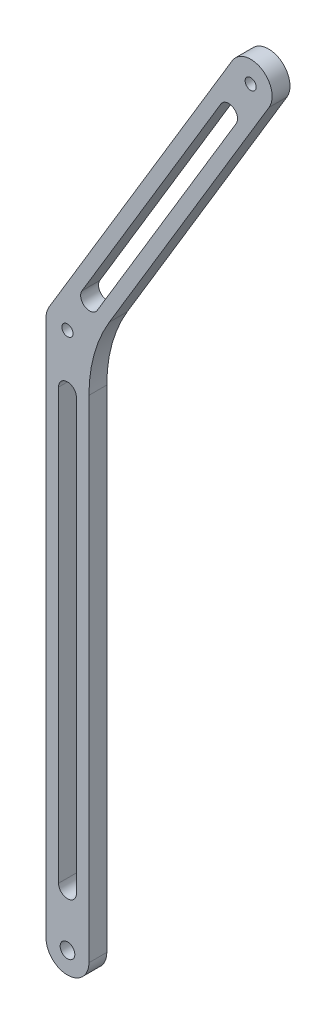
ISO-10303-21;
HEADER;
FILE_DESCRIPTION(('STEP AP214'),'2;1');
FILE_NAME('part.step','',(''),(''),'','','');
FILE_SCHEMA(('AUTOMOTIVE_DESIGN { 1 0 10303 214 1 1 1 1 }'));
ENDSEC;
DATA;
#1=APPLICATION_CONTEXT('core data for automotive mechanical design processes');
#2=APPLICATION_PROTOCOL_DEFINITION('international standard','automotive_design',2000,#1);
#3=PRODUCT_CONTEXT('',#1,'mechanical');
#4=PRODUCT('Part','Part','',(#3));
#5=PRODUCT_RELATED_PRODUCT_CATEGORY('part','',(#4));
#6=PRODUCT_DEFINITION_FORMATION('','',#4);
#7=PRODUCT_DEFINITION_CONTEXT('part definition',#1,'design');
#8=PRODUCT_DEFINITION('design','',#6,#7);
#9=PRODUCT_DEFINITION_SHAPE('','',#8);
#10=(LENGTH_UNIT() NAMED_UNIT(*) SI_UNIT(.MILLI.,.METRE.));
#11=(NAMED_UNIT(*) PLANE_ANGLE_UNIT() SI_UNIT($,.RADIAN.));
#12=(NAMED_UNIT(*) SI_UNIT($,.STERADIAN.) SOLID_ANGLE_UNIT());
#13=UNCERTAINTY_MEASURE_WITH_UNIT(LENGTH_MEASURE(1.E-05),#10,'distance_accuracy_value','');
#14=(GEOMETRIC_REPRESENTATION_CONTEXT(3) GLOBAL_UNCERTAINTY_ASSIGNED_CONTEXT((#13)) GLOBAL_UNIT_ASSIGNED_CONTEXT((#10,
#11,#12)) REPRESENTATION_CONTEXT('',''));
#15=CARTESIAN_POINT('',(0.,0.,0.));
#16=DIRECTION('',(0.,0.,1.));
#17=DIRECTION('',(1.,0.,0.));
#18=AXIS2_PLACEMENT_3D('',#15,#16,#17);
#19=CARTESIAN_POINT('',(-71.4517074672331,42.9315644578435,5.));
#20=DIRECTION('',(0.85717234641918,-0.515029677333489,0.));
#21=DIRECTION('',(0.515029677333489,0.85717234641918,0.));
#22=AXIS2_PLACEMENT_3D('',#19,#20,#21);
#23=PLANE('',#22);
#24=DIRECTION('',(-0.515029677333489,-0.85717234641918,0.));
#25=VECTOR('',#24,1.);
#26=CARTESIAN_POINT('',(-71.4517074672331,42.9315644578435,0.));
#27=LINE('',#26,#25);
#28=CARTESIAN_POINT('',(46.1024188161671,238.578826532709,0.));
#29=VERTEX_POINT('',#28);
#30=CARTESIAN_POINT('',(-5.14303407851509,153.290178064001,0.));
#31=VERTEX_POINT('',#30);
#32=EDGE_CURVE('E209',#29,#31,#27,.T.);
#33=ORIENTED_EDGE('',*,*,#32,.T.);
#34=DIRECTION('',(0.,0.,-1.));
#35=VECTOR('',#34,1.);
#36=CARTESIAN_POINT('',(-5.14303407851509,153.290178064001,5.));
#37=LINE('',#36,#35);
#38=CARTESIAN_POINT('',(-5.14303407851509,153.290178064001,5.));
#39=VERTEX_POINT('',#38);
#40=EDGE_CURVE('E281',#39,#31,#37,.T.);
#41=ORIENTED_EDGE('',*,*,#40,.F.);
#42=DIRECTION('',(-0.515029677333489,-0.85717234641918,0.));
#43=VECTOR('',#42,1.);
#44=CARTESIAN_POINT('',(-71.4517074672331,42.9315644578435,5.));
#45=LINE('',#44,#43);
#46=CARTESIAN_POINT('',(46.1024188161671,238.578826532709,5.));
#47=VERTEX_POINT('',#46);
#48=EDGE_CURVE('E216',#47,#39,#45,.T.);
#49=ORIENTED_EDGE('',*,*,#48,.F.);
#50=DIRECTION('',(0.,0.,-1.));
#51=VECTOR('',#50,1.);
#52=CARTESIAN_POINT('',(46.1024188161671,238.578826532709,5.));
#53=LINE('',#52,#51);
#54=EDGE_CURVE('E243',#47,#29,#53,.T.);
#55=ORIENTED_EDGE('',*,*,#54,.T.);
#56=EDGE_LOOP('',(#33,#41,#49,#55));
#57=FACE_BOUND('',#56,.T.);
#58=ADVANCED_FACE('F35',(#57),#23,.F.);
#59=CARTESIAN_POINT('',(0.,150.2,5.));
#60=DIRECTION('',(0.,0.,-1.));
#61=DIRECTION('',(-1.,0.,0.));
#62=AXIS2_PLACEMENT_3D('',#59,#60,#61);
#63=CYLINDRICAL_SURFACE('',#62,6.);
#64=CARTESIAN_POINT('',(0.,150.2,0.));
#65=DIRECTION('',(0.,0.,1.));
#66=DIRECTION('',(1.,0.,0.));
#67=AXIS2_PLACEMENT_3D('',#64,#65,#66);
#68=CIRCLE('',#67,6.);
#69=CARTESIAN_POINT('',(-6.00000000000001,150.2,0.));
#70=VERTEX_POINT('',#69);
#71=EDGE_CURVE('E246',#31,#70,#68,.T.);
#72=ORIENTED_EDGE('',*,*,#71,.T.);
#73=DIRECTION('',(0.,0.,-1.));
#74=VECTOR('',#73,1.);
#75=CARTESIAN_POINT('',(-6.00000000000001,150.2,5.));
#76=LINE('',#75,#74);
#77=CARTESIAN_POINT('',(-6.00000000000001,150.2,5.));
#78=VERTEX_POINT('',#77);
#79=EDGE_CURVE('E278',#78,#70,#76,.T.);
#80=ORIENTED_EDGE('',*,*,#79,.F.);
#81=CARTESIAN_POINT('',(0.,150.2,5.));
#82=DIRECTION('',(0.,0.,1.));
#83=DIRECTION('',(1.,0.,0.));
#84=AXIS2_PLACEMENT_3D('',#81,#82,#83);
#85=CIRCLE('',#84,6.);
#86=EDGE_CURVE('E219',#39,#78,#85,.T.);
#87=ORIENTED_EDGE('',*,*,#86,.F.);
#88=ORIENTED_EDGE('',*,*,#40,.T.);
#89=EDGE_LOOP('',(#72,#80,#87,#88));
#90=FACE_BOUND('',#89,.T.);
#91=ADVANCED_FACE('F318',(#90),#63,.T.);
#92=CARTESIAN_POINT('',(-6.,0.,5.));
#93=DIRECTION('',(1.,0.,0.));
#94=DIRECTION('',(0.,1.,0.));
#95=AXIS2_PLACEMENT_3D('',#92,#93,#94);
#96=PLANE('',#95);
#97=DIRECTION('',(0.,-1.,0.));
#98=VECTOR('',#97,1.);
#99=CARTESIAN_POINT('',(-6.,0.,0.));
#100=LINE('',#99,#98);
#101=CARTESIAN_POINT('',(-6.,0.,0.));
#102=VERTEX_POINT('',#101);
#103=EDGE_CURVE('E248',#70,#102,#100,.T.);
#104=ORIENTED_EDGE('',*,*,#103,.T.);
#105=DIRECTION('',(0.,0.,-1.));
#106=VECTOR('',#105,1.);
#107=CARTESIAN_POINT('',(-6.,0.,5.));
#108=LINE('',#107,#106);
#109=CARTESIAN_POINT('',(-6.,0.,5.));
#110=VERTEX_POINT('',#109);
#111=EDGE_CURVE('E275',#110,#102,#108,.T.);
#112=ORIENTED_EDGE('',*,*,#111,.F.);
#113=DIRECTION('',(0.,-1.,0.));
#114=VECTOR('',#113,1.);
#115=CARTESIAN_POINT('',(-6.,0.,5.));
#116=LINE('',#115,#114);
#117=EDGE_CURVE('E222',#78,#110,#116,.T.);
#118=ORIENTED_EDGE('',*,*,#117,.F.);
#119=ORIENTED_EDGE('',*,*,#79,.T.);
#120=EDGE_LOOP('',(#104,#112,#118,#119));
#121=FACE_BOUND('',#120,.T.);
#122=ADVANCED_FACE('F323',(#121),#96,.F.);
#123=CARTESIAN_POINT('',(0.,0.,5.));
#124=DIRECTION('',(0.,0.,-1.));
#125=DIRECTION('',(-1.,0.,0.));
#126=AXIS2_PLACEMENT_3D('',#123,#124,#125);
#127=CYLINDRICAL_SURFACE('',#126,6.);
#128=CARTESIAN_POINT('',(0.,0.,0.));
#129=DIRECTION('',(0.,0.,1.));
#130=DIRECTION('',(1.,0.,0.));
#131=AXIS2_PLACEMENT_3D('',#128,#129,#130);
#132=CIRCLE('',#131,6.);
#133=CARTESIAN_POINT('',(6.,0.,0.));
#134=VERTEX_POINT('',#133);
#135=EDGE_CURVE('E250',#102,#134,#132,.T.);
#136=ORIENTED_EDGE('',*,*,#135,.T.);
#137=DIRECTION('',(0.,0.,-1.));
#138=VECTOR('',#137,1.);
#139=CARTESIAN_POINT('',(6.,0.,5.));
#140=LINE('',#139,#138);
#141=CARTESIAN_POINT('',(6.,0.,5.));
#142=VERTEX_POINT('',#141);
#143=EDGE_CURVE('E272',#142,#134,#140,.T.);
#144=ORIENTED_EDGE('',*,*,#143,.F.);
#145=CARTESIAN_POINT('',(0.,0.,5.));
#146=DIRECTION('',(0.,0.,1.));
#147=DIRECTION('',(1.,0.,0.));
#148=AXIS2_PLACEMENT_3D('',#145,#146,#147);
#149=CIRCLE('',#148,6.);
#150=EDGE_CURVE('E224',#110,#142,#149,.T.);
#151=ORIENTED_EDGE('',*,*,#150,.F.);
#152=ORIENTED_EDGE('',*,*,#111,.T.);
#153=EDGE_LOOP('',(#136,#144,#151,#152));
#154=FACE_BOUND('',#153,.T.);
#155=ADVANCED_FACE('F326',(#154),#127,.T.);
#156=CARTESIAN_POINT('',(6.,0.,5.));
#157=DIRECTION('',(1.,0.,0.));
#158=DIRECTION('',(0.,1.,0.));
#159=AXIS2_PLACEMENT_3D('',#156,#157,#158);
#160=PLANE('',#159);
#161=DIRECTION('',(0.,-1.,0.));
#162=VECTOR('',#161,1.);
#163=CARTESIAN_POINT('',(6.,0.,0.));
#164=LINE('',#163,#162);
#165=CARTESIAN_POINT('',(6.00000000000002,137.44331363052,0.));
#166=VERTEX_POINT('',#165);
#167=EDGE_CURVE('E253',#166,#134,#164,.T.);
#168=ORIENTED_EDGE('',*,*,#167,.F.);
#169=DIRECTION('',(0.,0.,-1.));
#170=VECTOR('',#169,1.);
#171=CARTESIAN_POINT('',(6.00000000000002,137.44331363052,5.));
#172=LINE('',#171,#170);
#173=CARTESIAN_POINT('',(6.00000000000002,137.44331363052,5.));
#174=VERTEX_POINT('',#173);
#175=EDGE_CURVE('E287',#166,#174,#172,.F.);
#176=ORIENTED_EDGE('',*,*,#175,.T.);
#177=DIRECTION('',(0.,-1.,0.));
#178=VECTOR('',#177,1.);
#179=CARTESIAN_POINT('',(6.,0.,5.));
#180=LINE('',#179,#178);
#181=EDGE_CURVE('E227',#174,#142,#180,.T.);
#182=ORIENTED_EDGE('',*,*,#181,.T.);
#183=ORIENTED_EDGE('',*,*,#143,.T.);
#184=EDGE_LOOP('',(#168,#176,#182,#183));
#185=FACE_BOUND('',#184,.T.);
#186=ADVANCED_FACE('F299',(#185),#160,.T.);
#187=CARTESIAN_POINT('',(-61.165639310203,36.7512083298416,5.));
#188=DIRECTION('',(0.85717234641918,-0.515029677333489,0.));
#189=DIRECTION('',(0.515029677333489,0.85717234641918,0.));
#190=AXIS2_PLACEMENT_3D('',#187,#188,#189);
#191=PLANE('',#190);
#192=DIRECTION('',(-0.515029677333489,-0.85717234641918,0.));
#193=VECTOR('',#192,1.);
#194=CARTESIAN_POINT('',(-61.165639310203,36.7512083298416,5.));
#195=LINE('',#194,#193);
#196=CARTESIAN_POINT('',(56.3884869731972,232.398470404707,5.));
#197=VERTEX_POINT('',#196);
#198=CARTESIAN_POINT('',(11.7131061432329,158.04450072386,5.));
#199=VERTEX_POINT('',#198);
#200=EDGE_CURVE('E229',#197,#199,#195,.T.);
#201=ORIENTED_EDGE('',*,*,#200,.T.);
#202=DIRECTION('',(0.,0.,-1.));
#203=VECTOR('',#202,1.);
#204=CARTESIAN_POINT('',(11.7131061432328,158.04450072386,0.));
#205=LINE('',#204,#203);
#206=CARTESIAN_POINT('',(11.7131061432329,158.04450072386,0.));
#207=VERTEX_POINT('',#206);
#208=EDGE_CURVE('E284',#199,#207,#205,.T.);
#209=ORIENTED_EDGE('',*,*,#208,.T.);
#210=DIRECTION('',(-0.515029677333489,-0.85717234641918,0.));
#211=VECTOR('',#210,1.);
#212=CARTESIAN_POINT('',(-61.165639310203,36.7512083298416,0.));
#213=LINE('',#212,#211);
#214=CARTESIAN_POINT('',(56.3884869731972,232.398470404707,0.));
#215=VERTEX_POINT('',#214);
#216=EDGE_CURVE('E255',#215,#207,#213,.T.);
#217=ORIENTED_EDGE('',*,*,#216,.F.);
#218=DIRECTION('',(0.,0.,-1.));
#219=VECTOR('',#218,1.);
#220=CARTESIAN_POINT('',(56.3884869731972,232.398470404707,5.));
#221=LINE('',#220,#219);
#222=EDGE_CURVE('E270',#197,#215,#221,.T.);
#223=ORIENTED_EDGE('',*,*,#222,.F.);
#224=EDGE_LOOP('',(#201,#209,#217,#223));
#225=FACE_BOUND('',#224,.T.);
#226=ADVANCED_FACE('F308',(#225),#191,.T.);
#227=CARTESIAN_POINT('',(0.,150.2,5.));
#228=DIRECTION('',(0.,0.,-1.));
#229=DIRECTION('',(-1.,0.,0.));
#230=AXIS2_PLACEMENT_3D('',#227,#228,#229);
#231=CYLINDRICAL_SURFACE('',#230,1.55);
#232=CARTESIAN_POINT('',(0.,150.2,5.));
#233=DIRECTION('',(0.,0.,1.));
#234=DIRECTION('',(1.,0.,0.));
#235=AXIS2_PLACEMENT_3D('',#232,#233,#234);
#236=CIRCLE('',#235,1.55);
#237=CARTESIAN_POINT('',(1.55,150.2,5.));
#238=VERTEX_POINT('',#237);
#239=EDGE_CURVE('E237',#238,#238,#236,.T.);
#240=ORIENTED_EDGE('',*,*,#239,.T.);
#241=EDGE_LOOP('',(#240));
#242=FACE_BOUND('',#241,.T.);
#243=CARTESIAN_POINT('',(0.,150.2,0.));
#244=DIRECTION('',(0.,0.,1.));
#245=DIRECTION('',(1.,0.,0.));
#246=AXIS2_PLACEMENT_3D('',#243,#244,#245);
#247=CIRCLE('',#246,1.55);
#248=CARTESIAN_POINT('',(1.55,150.2,0.));
#249=VERTEX_POINT('',#248);
#250=EDGE_CURVE('E263',#249,#249,#247,.T.);
#251=ORIENTED_EDGE('',*,*,#250,.F.);
#252=EDGE_LOOP('',(#251));
#253=FACE_BOUND('',#252,.T.);
#254=ADVANCED_FACE('F356',(#242,#253),#231,.F.);
#255=CARTESIAN_POINT('',(0.,0.,5.));
#256=DIRECTION('',(0.,0.,-1.));
#257=DIRECTION('',(-1.,0.,0.));
#258=AXIS2_PLACEMENT_3D('',#255,#256,#257);
#259=CYLINDRICAL_SURFACE('',#258,2.05);
#260=CARTESIAN_POINT('',(0.,0.,5.));
#261=DIRECTION('',(0.,0.,1.));
#262=DIRECTION('',(1.,0.,0.));
#263=AXIS2_PLACEMENT_3D('',#260,#261,#262);
#264=CIRCLE('',#263,2.05);
#265=CARTESIAN_POINT('',(2.05,0.,5.));
#266=VERTEX_POINT('',#265);
#267=EDGE_CURVE('E234',#266,#266,#264,.T.);
#268=ORIENTED_EDGE('',*,*,#267,.T.);
#269=EDGE_LOOP('',(#268));
#270=FACE_BOUND('',#269,.T.);
#271=CARTESIAN_POINT('',(0.,0.,0.));
#272=DIRECTION('',(0.,0.,1.));
#273=DIRECTION('',(1.,0.,0.));
#274=AXIS2_PLACEMENT_3D('',#271,#272,#273);
#275=CIRCLE('',#274,2.05);
#276=CARTESIAN_POINT('',(2.05,0.,0.));
#277=VERTEX_POINT('',#276);
#278=EDGE_CURVE('E260',#277,#277,#275,.T.);
#279=ORIENTED_EDGE('',*,*,#278,.F.);
#280=EDGE_LOOP('',(#279));
#281=FACE_BOUND('',#280,.T.);
#282=ADVANCED_FACE('F361',(#270,#281),#259,.F.);
#283=CARTESIAN_POINT('',(51.2454528946822,235.488648468708,5.));
#284=DIRECTION('',(0.,0.,-1.));
#285=DIRECTION('',(-1.,0.,0.));
#286=AXIS2_PLACEMENT_3D('',#283,#284,#285);
#287=CYLINDRICAL_SURFACE('',#286,5.99999999999999);
#288=CARTESIAN_POINT('',(51.2454528946822,235.488648468708,0.));
#289=DIRECTION('',(0.,0.,1.));
#290=DIRECTION('',(1.,0.,0.));
#291=AXIS2_PLACEMENT_3D('',#288,#289,#290);
#292=CIRCLE('',#291,5.99999999999999);
#293=EDGE_CURVE('E258',#215,#29,#292,.T.);
#294=ORIENTED_EDGE('',*,*,#293,.T.);
#295=ORIENTED_EDGE('',*,*,#54,.F.);
#296=CARTESIAN_POINT('',(51.2454528946822,235.488648468708,5.));
#297=DIRECTION('',(0.,0.,1.));
#298=DIRECTION('',(1.,0.,0.));
#299=AXIS2_PLACEMENT_3D('',#296,#297,#298);
#300=CIRCLE('',#299,5.99999999999999);
#301=EDGE_CURVE('E232',#197,#47,#300,.T.);
#302=ORIENTED_EDGE('',*,*,#301,.F.);
#303=ORIENTED_EDGE('',*,*,#222,.T.);
#304=EDGE_LOOP('',(#294,#295,#302,#303));
#305=FACE_BOUND('',#304,.T.);
#306=ADVANCED_FACE('F312',(#305),#287,.T.);
#307=CARTESIAN_POINT('',(51.2454528946822,235.488648468708,5.));
#308=DIRECTION('',(0.,0.,-1.));
#309=DIRECTION('',(-1.,0.,0.));
#310=AXIS2_PLACEMENT_3D('',#307,#308,#309);
#311=CYLINDRICAL_SURFACE('',#310,1.55);
#312=CARTESIAN_POINT('',(51.2454528946822,235.488648468708,5.));
#313=DIRECTION('',(0.,0.,1.));
#314=DIRECTION('',(1.,0.,0.));
#315=AXIS2_PLACEMENT_3D('',#312,#313,#314);
#316=CIRCLE('',#315,1.55);
#317=CARTESIAN_POINT('',(52.7954528946822,235.488648468708,5.));
#318=VERTEX_POINT('',#317);
#319=EDGE_CURVE('E240',#318,#318,#316,.T.);
#320=ORIENTED_EDGE('',*,*,#319,.T.);
#321=EDGE_LOOP('',(#320));
#322=FACE_BOUND('',#321,.T.);
#323=CARTESIAN_POINT('',(51.2454528946822,235.488648468708,0.));
#324=DIRECTION('',(0.,0.,1.));
#325=DIRECTION('',(1.,0.,0.));
#326=AXIS2_PLACEMENT_3D('',#323,#324,#325);
#327=CIRCLE('',#326,1.55);
#328=CARTESIAN_POINT('',(52.7954528946822,235.488648468708,0.));
#329=VERTEX_POINT('',#328);
#330=EDGE_CURVE('E220',#329,#329,#327,.T.);
#331=ORIENTED_EDGE('',*,*,#330,.F.);
#332=EDGE_LOOP('',(#331));
#333=FACE_BOUND('',#332,.T.);
#334=ADVANCED_FACE('F382',(#322,#333),#311,.F.);
#335=CARTESIAN_POINT('',(0.,0.,5.));
#336=DIRECTION('',(0.,0.,1.));
#337=DIRECTION('',(1.,0.,0.));
#338=AXIS2_PLACEMENT_3D('',#335,#336,#337);
#339=PLANE('',#338);
#340=CARTESIAN_POINT('',(45.0650967666803,225.202580311678,5.));
#341=DIRECTION('',(0.,0.,1.));
#342=DIRECTION('',(1.,0.,0.));
#343=AXIS2_PLACEMENT_3D('',#340,#341,#342);
#344=CIRCLE('',#343,2.5);
#345=CARTESIAN_POINT('',(47.2080276327283,223.915006118345,5.));
#346=VERTEX_POINT('',#345);
#347=CARTESIAN_POINT('',(42.9221659006324,226.490154505012,5.));
#348=VERTEX_POINT('',#347);
#349=EDGE_CURVE('E50',#346,#348,#344,.T.);
#350=ORIENTED_EDGE('',*,*,#349,.F.);
#351=DIRECTION('',(0.515029677333489,0.85717234641918,0.));
#352=VECTOR('',#351,1.);
#353=CARTESIAN_POINT('',(47.2080276327283,223.915006118345,5.));
#354=LINE('',#353,#352);
#355=CARTESIAN_POINT('',(8.32328699404983,159.198493963696,5.));
#356=VERTEX_POINT('',#355);
#357=EDGE_CURVE('E165',#356,#346,#354,.T.);
#358=ORIENTED_EDGE('',*,*,#357,.F.);
#359=CARTESIAN_POINT('',(6.18035612800187,160.48606815703,5.));
#360=DIRECTION('',(0.,0.,1.));
#361=DIRECTION('',(1.,0.,0.));
#362=AXIS2_PLACEMENT_3D('',#359,#360,#361);
#363=CIRCLE('',#362,2.50000000000001);
#364=CARTESIAN_POINT('',(4.03742526195391,161.773642350364,5.));
#365=VERTEX_POINT('',#364);
#366=EDGE_CURVE('E168',#365,#356,#363,.T.);
#367=ORIENTED_EDGE('',*,*,#366,.F.);
#368=DIRECTION('',(-0.515029677333489,-0.857172346419179,0.));
#369=VECTOR('',#368,1.);
#370=CARTESIAN_POINT('',(42.9221659006324,226.490154505012,5.));
#371=LINE('',#370,#369);
#372=EDGE_CURVE('E174',#348,#365,#371,.T.);
#373=ORIENTED_EDGE('',*,*,#372,.F.);
#374=EDGE_LOOP('',(#350,#358,#367,#373));
#375=FACE_BOUND('',#374,.T.);
#376=CARTESIAN_POINT('',(0.,135.2,5.));
#377=DIRECTION('',(0.,0.,1.));
#378=DIRECTION('',(1.,0.,0.));
#379=AXIS2_PLACEMENT_3D('',#376,#377,#378);
#380=CIRCLE('',#379,2.5);
#381=CARTESIAN_POINT('',(2.5,135.2,5.));
#382=VERTEX_POINT('',#381);
#383=CARTESIAN_POINT('',(-2.5,135.2,5.));
#384=VERTEX_POINT('',#383);
#385=EDGE_CURVE('E180',#382,#384,#380,.T.);
#386=ORIENTED_EDGE('',*,*,#385,.F.);
#387=DIRECTION('',(0.,1.,0.));
#388=VECTOR('',#387,1.);
#389=CARTESIAN_POINT('',(2.5,135.2,5.));
#390=LINE('',#389,#388);
#391=CARTESIAN_POINT('',(2.50000000000002,15.,5.));
#392=VERTEX_POINT('',#391);
#393=EDGE_CURVE('E188',#392,#382,#390,.T.);
#394=ORIENTED_EDGE('',*,*,#393,.F.);
#395=CARTESIAN_POINT('',(0.,15.,5.));
#396=DIRECTION('',(0.,0.,1.));
#397=DIRECTION('',(1.,0.,0.));
#398=AXIS2_PLACEMENT_3D('',#395,#396,#397);
#399=CIRCLE('',#398,2.5);
#400=CARTESIAN_POINT('',(-2.49999999999998,15.,5.));
#401=VERTEX_POINT('',#400);
#402=EDGE_CURVE('E202',#401,#392,#399,.T.);
#403=ORIENTED_EDGE('',*,*,#402,.F.);
#404=DIRECTION('',(0.,-1.,0.));
#405=VECTOR('',#404,1.);
#406=CARTESIAN_POINT('',(-2.5,135.2,5.));
#407=LINE('',#406,#405);
#408=EDGE_CURVE('E199',#384,#401,#407,.T.);
#409=ORIENTED_EDGE('',*,*,#408,.F.);
#410=EDGE_LOOP('',(#386,#394,#403,#409));
#411=FACE_BOUND('',#410,.T.);
#412=ORIENTED_EDGE('',*,*,#48,.T.);
#413=ORIENTED_EDGE('',*,*,#86,.T.);
#414=ORIENTED_EDGE('',*,*,#117,.T.);
#415=ORIENTED_EDGE('',*,*,#150,.T.);
#416=ORIENTED_EDGE('',*,*,#181,.F.);
#417=CARTESIAN_POINT('',(46.,137.44331363052,5.));
#418=DIRECTION('',(0.,0.,1.));
#419=DIRECTION('',(1.,0.,0.));
#420=AXIS2_PLACEMENT_3D('',#417,#418,#419);
#421=CIRCLE('',#420,40.);
#422=EDGE_CURVE('E11',#174,#199,#421,.F.);
#423=ORIENTED_EDGE('',*,*,#422,.T.);
#424=ORIENTED_EDGE('',*,*,#200,.F.);
#425=ORIENTED_EDGE('',*,*,#301,.T.);
#426=EDGE_LOOP('',(#412,#413,#414,#415,#416,#423,#424,#425));
#427=FACE_BOUND('',#426,.T.);
#428=ORIENTED_EDGE('',*,*,#267,.F.);
#429=EDGE_LOOP('',(#428));
#430=FACE_BOUND('',#429,.T.);
#431=ORIENTED_EDGE('',*,*,#239,.F.);
#432=EDGE_LOOP('',(#431));
#433=FACE_BOUND('',#432,.T.);
#434=ORIENTED_EDGE('',*,*,#319,.F.);
#435=EDGE_LOOP('',(#434));
#436=FACE_BOUND('',#435,.T.);
#437=ADVANCED_FACE('F305',(#375,#411,#427,#430,#433,#436),#339,.T.);
#438=CARTESIAN_POINT('',(0.,0.,0.));
#439=DIRECTION('',(0.,0.,1.));
#440=DIRECTION('',(1.,0.,0.));
#441=AXIS2_PLACEMENT_3D('',#438,#439,#440);
#442=PLANE('',#441);
#443=DIRECTION('',(0.515029677333489,0.85717234641918,0.));
#444=VECTOR('',#443,1.);
#445=CARTESIAN_POINT('',(47.2080276327283,223.915006118345,0.));
#446=LINE('',#445,#444);
#447=CARTESIAN_POINT('',(8.32328699404983,159.198493963696,0.));
#448=VERTEX_POINT('',#447);
#449=CARTESIAN_POINT('',(47.2080276327283,223.915006118345,0.));
#450=VERTEX_POINT('',#449);
#451=EDGE_CURVE('E155',#448,#450,#446,.T.);
#452=ORIENTED_EDGE('',*,*,#451,.T.);
#453=CARTESIAN_POINT('',(45.0650967666803,225.202580311678,0.));
#454=DIRECTION('',(0.,0.,1.));
#455=DIRECTION('',(1.,0.,0.));
#456=AXIS2_PLACEMENT_3D('',#453,#454,#455);
#457=CIRCLE('',#456,2.5);
#458=CARTESIAN_POINT('',(42.9221659006324,226.490154505012,0.));
#459=VERTEX_POINT('',#458);
#460=EDGE_CURVE('E149',#450,#459,#457,.T.);
#461=ORIENTED_EDGE('',*,*,#460,.T.);
#462=DIRECTION('',(-0.515029677333489,-0.857172346419179,0.));
#463=VECTOR('',#462,1.);
#464=CARTESIAN_POINT('',(42.9221659006324,226.490154505012,0.));
#465=LINE('',#464,#463);
#466=CARTESIAN_POINT('',(4.0374252619539,161.773642350364,0.));
#467=VERTEX_POINT('',#466);
#468=EDGE_CURVE('E158',#459,#467,#465,.T.);
#469=ORIENTED_EDGE('',*,*,#468,.T.);
#470=CARTESIAN_POINT('',(6.18035612800187,160.48606815703,0.));
#471=DIRECTION('',(0.,0.,1.));
#472=DIRECTION('',(1.,0.,0.));
#473=AXIS2_PLACEMENT_3D('',#470,#471,#472);
#474=CIRCLE('',#473,2.50000000000001);
#475=EDGE_CURVE('E58',#467,#448,#474,.T.);
#476=ORIENTED_EDGE('',*,*,#475,.T.);
#477=EDGE_LOOP('',(#452,#461,#469,#476));
#478=FACE_BOUND('',#477,.T.);
#479=DIRECTION('',(0.,1.,0.));
#480=VECTOR('',#479,1.);
#481=CARTESIAN_POINT('',(2.5,135.2,0.));
#482=LINE('',#481,#480);
#483=CARTESIAN_POINT('',(2.50000000000002,15.,0.));
#484=VERTEX_POINT('',#483);
#485=CARTESIAN_POINT('',(2.5,135.2,0.));
#486=VERTEX_POINT('',#485);
#487=EDGE_CURVE('E194',#484,#486,#482,.T.);
#488=ORIENTED_EDGE('',*,*,#487,.T.);
#489=CARTESIAN_POINT('',(0.,135.2,0.));
#490=DIRECTION('',(0.,0.,1.));
#491=DIRECTION('',(1.,0.,0.));
#492=AXIS2_PLACEMENT_3D('',#489,#490,#491);
#493=CIRCLE('',#492,2.5);
#494=CARTESIAN_POINT('',(-2.5,135.2,0.));
#495=VERTEX_POINT('',#494);
#496=EDGE_CURVE('E184',#486,#495,#493,.T.);
#497=ORIENTED_EDGE('',*,*,#496,.T.);
#498=DIRECTION('',(0.,-1.,0.));
#499=VECTOR('',#498,1.);
#500=CARTESIAN_POINT('',(-2.5,135.2,0.));
#501=LINE('',#500,#499);
#502=CARTESIAN_POINT('',(-2.49999999999998,15.,0.));
#503=VERTEX_POINT('',#502);
#504=EDGE_CURVE('E187',#495,#503,#501,.T.);
#505=ORIENTED_EDGE('',*,*,#504,.T.);
#506=CARTESIAN_POINT('',(0.,15.,0.));
#507=DIRECTION('',(0.,0.,1.));
#508=DIRECTION('',(1.,0.,0.));
#509=AXIS2_PLACEMENT_3D('',#506,#507,#508);
#510=CIRCLE('',#509,2.5);
#511=EDGE_CURVE('E191',#503,#484,#510,.T.);
#512=ORIENTED_EDGE('',*,*,#511,.T.);
#513=EDGE_LOOP('',(#488,#497,#505,#512));
#514=FACE_BOUND('',#513,.T.);
#515=ORIENTED_EDGE('',*,*,#32,.F.);
#516=ORIENTED_EDGE('',*,*,#293,.F.);
#517=ORIENTED_EDGE('',*,*,#216,.T.);
#518=CARTESIAN_POINT('',(46.,137.44331363052,0.));
#519=DIRECTION('',(0.,0.,1.));
#520=DIRECTION('',(1.,0.,0.));
#521=AXIS2_PLACEMENT_3D('',#518,#519,#520);
#522=CIRCLE('',#521,40.);
#523=EDGE_CURVE('E43',#207,#166,#522,.T.);
#524=ORIENTED_EDGE('',*,*,#523,.T.);
#525=ORIENTED_EDGE('',*,*,#167,.T.);
#526=ORIENTED_EDGE('',*,*,#135,.F.);
#527=ORIENTED_EDGE('',*,*,#103,.F.);
#528=ORIENTED_EDGE('',*,*,#71,.F.);
#529=EDGE_LOOP('',(#515,#516,#517,#524,#525,#526,#527,#528));
#530=FACE_BOUND('',#529,.T.);
#531=ORIENTED_EDGE('',*,*,#278,.T.);
#532=EDGE_LOOP('',(#531));
#533=FACE_BOUND('',#532,.T.);
#534=ORIENTED_EDGE('',*,*,#250,.T.);
#535=EDGE_LOOP('',(#534));
#536=FACE_BOUND('',#535,.T.);
#537=ORIENTED_EDGE('',*,*,#330,.T.);
#538=EDGE_LOOP('',(#537));
#539=FACE_BOUND('',#538,.T.);
#540=ADVANCED_FACE('F162',(#478,#514,#530,#533,#536,#539),#442,.F.);
#541=CARTESIAN_POINT('',(46.,137.44331363052,5.));
#542=DIRECTION('',(0.,0.,1.));
#543=DIRECTION('',(1.,0.,0.));
#544=AXIS2_PLACEMENT_3D('',#541,#542,#543);
#545=CYLINDRICAL_SURFACE('',#544,40.);
#546=ORIENTED_EDGE('',*,*,#422,.F.);
#547=ORIENTED_EDGE('',*,*,#175,.F.);
#548=ORIENTED_EDGE('',*,*,#523,.F.);
#549=ORIENTED_EDGE('',*,*,#208,.F.);
#550=EDGE_LOOP('',(#546,#547,#548,#549));
#551=FACE_BOUND('',#550,.T.);
#552=ADVANCED_FACE('F37',(#551),#545,.F.);
#553=CARTESIAN_POINT('',(0.,135.2,0.));
#554=DIRECTION('',(0.,0.,1.));
#555=DIRECTION('',(1.,0.,0.));
#556=AXIS2_PLACEMENT_3D('',#553,#554,#555);
#557=CYLINDRICAL_SURFACE('',#556,2.5);
#558=ORIENTED_EDGE('',*,*,#385,.T.);
#559=DIRECTION('',(0.,0.,1.));
#560=VECTOR('',#559,1.);
#561=CARTESIAN_POINT('',(-2.5,135.2,0.));
#562=LINE('',#561,#560);
#563=EDGE_CURVE('E197',#495,#384,#562,.T.);
#564=ORIENTED_EDGE('',*,*,#563,.F.);
#565=ORIENTED_EDGE('',*,*,#496,.F.);
#566=DIRECTION('',(0.,0.,1.));
#567=VECTOR('',#566,1.);
#568=CARTESIAN_POINT('',(2.5,135.2,0.));
#569=LINE('',#568,#567);
#570=EDGE_CURVE('E207',#486,#382,#569,.T.);
#571=ORIENTED_EDGE('',*,*,#570,.T.);
#572=EDGE_LOOP('',(#558,#564,#565,#571));
#573=FACE_BOUND('',#572,.T.);
#574=ADVANCED_FACE('F413',(#573),#557,.F.);
#575=CARTESIAN_POINT('',(2.5,135.2,0.));
#576=DIRECTION('',(1.,0.,0.));
#577=DIRECTION('',(0.,1.,0.));
#578=AXIS2_PLACEMENT_3D('',#575,#576,#577);
#579=PLANE('',#578);
#580=ORIENTED_EDGE('',*,*,#393,.T.);
#581=ORIENTED_EDGE('',*,*,#570,.F.);
#582=ORIENTED_EDGE('',*,*,#487,.F.);
#583=DIRECTION('',(0.,0.,1.));
#584=VECTOR('',#583,1.);
#585=CARTESIAN_POINT('',(2.50000000000002,15.,0.));
#586=LINE('',#585,#584);
#587=EDGE_CURVE('E210',#484,#392,#586,.T.);
#588=ORIENTED_EDGE('',*,*,#587,.T.);
#589=EDGE_LOOP('',(#580,#581,#582,#588));
#590=FACE_BOUND('',#589,.T.);
#591=ADVANCED_FACE('F423',(#590),#579,.F.);
#592=CARTESIAN_POINT('',(0.,15.,0.));
#593=DIRECTION('',(0.,0.,1.));
#594=DIRECTION('',(1.,0.,0.));
#595=AXIS2_PLACEMENT_3D('',#592,#593,#594);
#596=CYLINDRICAL_SURFACE('',#595,2.5);
#597=ORIENTED_EDGE('',*,*,#402,.T.);
#598=ORIENTED_EDGE('',*,*,#587,.F.);
#599=ORIENTED_EDGE('',*,*,#511,.F.);
#600=DIRECTION('',(0.,0.,1.));
#601=VECTOR('',#600,1.);
#602=CARTESIAN_POINT('',(-2.49999999999998,15.,0.));
#603=LINE('',#602,#601);
#604=EDGE_CURVE('E212',#503,#401,#603,.T.);
#605=ORIENTED_EDGE('',*,*,#604,.T.);
#606=EDGE_LOOP('',(#597,#598,#599,#605));
#607=FACE_BOUND('',#606,.T.);
#608=ADVANCED_FACE('F433',(#607),#596,.F.);
#609=CARTESIAN_POINT('',(-2.5,135.2,0.));
#610=DIRECTION('',(-1.,0.,0.));
#611=DIRECTION('',(0.,-1.,0.));
#612=AXIS2_PLACEMENT_3D('',#609,#610,#611);
#613=PLANE('',#612);
#614=ORIENTED_EDGE('',*,*,#408,.T.);
#615=ORIENTED_EDGE('',*,*,#604,.F.);
#616=ORIENTED_EDGE('',*,*,#504,.F.);
#617=ORIENTED_EDGE('',*,*,#563,.T.);
#618=EDGE_LOOP('',(#614,#615,#616,#617));
#619=FACE_BOUND('',#618,.T.);
#620=ADVANCED_FACE('F443',(#619),#613,.F.);
#621=CARTESIAN_POINT('',(45.0650967666803,225.202580311678,0.));
#622=DIRECTION('',(0.,0.,1.));
#623=DIRECTION('',(1.,0.,0.));
#624=AXIS2_PLACEMENT_3D('',#621,#622,#623);
#625=CYLINDRICAL_SURFACE('',#624,2.5);
#626=ORIENTED_EDGE('',*,*,#349,.T.);
#627=DIRECTION('',(0.,0.,1.));
#628=VECTOR('',#627,1.);
#629=CARTESIAN_POINT('',(42.9221659006324,226.490154505012,0.));
#630=LINE('',#629,#628);
#631=EDGE_CURVE('E145',#459,#348,#630,.T.);
#632=ORIENTED_EDGE('',*,*,#631,.F.);
#633=ORIENTED_EDGE('',*,*,#460,.F.);
#634=DIRECTION('',(0.,0.,1.));
#635=VECTOR('',#634,1.);
#636=CARTESIAN_POINT('',(47.2080276327283,223.915006118345,0.));
#637=LINE('',#636,#635);
#638=EDGE_CURVE('E178',#450,#346,#637,.T.);
#639=ORIENTED_EDGE('',*,*,#638,.T.);
#640=EDGE_LOOP('',(#626,#632,#633,#639));
#641=FACE_BOUND('',#640,.T.);
#642=ADVANCED_FACE('F147',(#641),#625,.F.);
#643=CARTESIAN_POINT('',(47.2080276327283,223.915006118345,0.));
#644=DIRECTION('',(0.85717234641918,-0.515029677333489,0.));
#645=DIRECTION('',(0.515029677333489,0.85717234641918,0.));
#646=AXIS2_PLACEMENT_3D('',#643,#644,#645);
#647=PLANE('',#646);
#648=ORIENTED_EDGE('',*,*,#357,.T.);
#649=ORIENTED_EDGE('',*,*,#638,.F.);
#650=ORIENTED_EDGE('',*,*,#451,.F.);
#651=DIRECTION('',(0.,0.,1.));
#652=VECTOR('',#651,1.);
#653=CARTESIAN_POINT('',(8.32328699404983,159.198493963696,0.));
#654=LINE('',#653,#652);
#655=EDGE_CURVE('E181',#448,#356,#654,.T.);
#656=ORIENTED_EDGE('',*,*,#655,.T.);
#657=EDGE_LOOP('',(#648,#649,#650,#656));
#658=FACE_BOUND('',#657,.T.);
#659=ADVANCED_FACE('F479',(#658),#647,.F.);
#660=CARTESIAN_POINT('',(6.18035612800187,160.48606815703,0.));
#661=DIRECTION('',(0.,0.,1.));
#662=DIRECTION('',(1.,0.,0.));
#663=AXIS2_PLACEMENT_3D('',#660,#661,#662);
#664=CYLINDRICAL_SURFACE('',#663,2.50000000000001);
#665=ORIENTED_EDGE('',*,*,#366,.T.);
#666=ORIENTED_EDGE('',*,*,#655,.F.);
#667=ORIENTED_EDGE('',*,*,#475,.F.);
#668=DIRECTION('',(0.,0.,1.));
#669=VECTOR('',#668,1.);
#670=CARTESIAN_POINT('',(4.03742526195391,161.773642350364,0.));
#671=LINE('',#670,#669);
#672=EDGE_CURVE('E154',#467,#365,#671,.T.);
#673=ORIENTED_EDGE('',*,*,#672,.T.);
#674=EDGE_LOOP('',(#665,#666,#667,#673));
#675=FACE_BOUND('',#674,.T.);
#676=ADVANCED_FACE('F488',(#675),#664,.F.);
#677=CARTESIAN_POINT('',(42.9221659006324,226.490154505012,0.));
#678=DIRECTION('',(-0.85717234641918,0.515029677333489,0.));
#679=DIRECTION('',(-0.515029677333489,-0.85717234641918,0.));
#680=AXIS2_PLACEMENT_3D('',#677,#678,#679);
#681=PLANE('',#680);
#682=ORIENTED_EDGE('',*,*,#372,.T.);
#683=ORIENTED_EDGE('',*,*,#672,.F.);
#684=ORIENTED_EDGE('',*,*,#468,.F.);
#685=ORIENTED_EDGE('',*,*,#631,.T.);
#686=EDGE_LOOP('',(#682,#683,#684,#685));
#687=FACE_BOUND('',#686,.T.);
#688=ADVANCED_FACE('F159',(#687),#681,.F.);
#689=CLOSED_SHELL('',(#58,#91,#122,#155,#186,#226,#254,#282,#306,#334,#437,#540,#552,#574,#591,
#608,#620,#642,#659,#676,#688));
#690=MANIFOLD_SOLID_BREP('B2',#689);
#691=ADVANCED_BREP_SHAPE_REPRESENTATION('',(#18,#690),#14);
#692=SHAPE_DEFINITION_REPRESENTATION(#9,#691);
ENDSEC;
END-ISO-10303-21;
